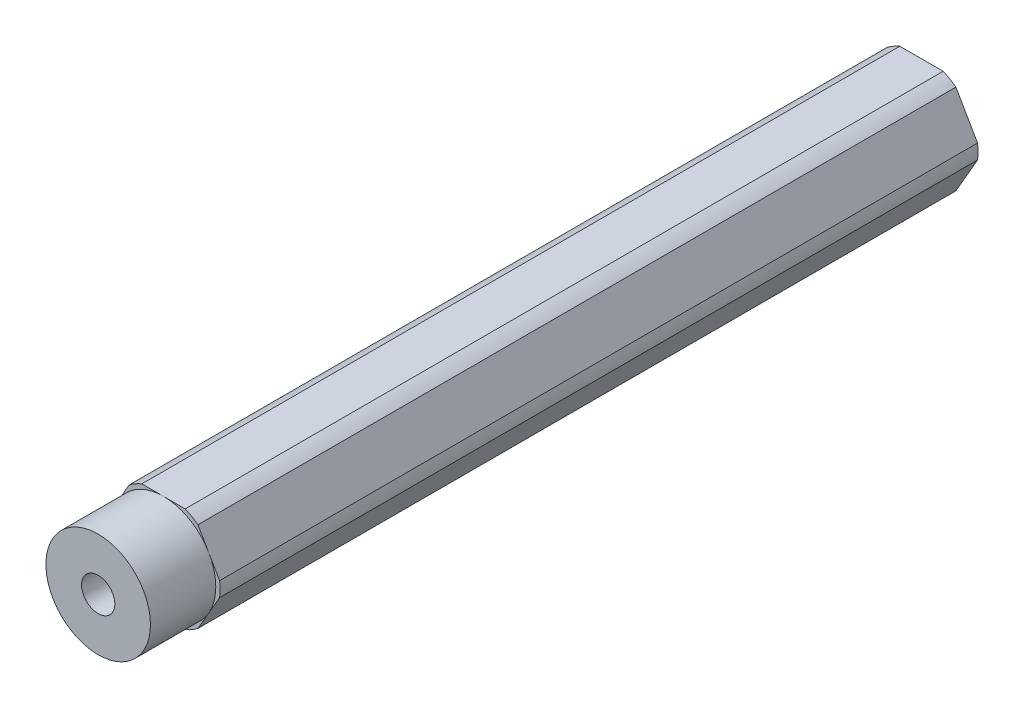
ISO-10303-21;
HEADER;
FILE_DESCRIPTION(('STEP AP214'),'2;1');
FILE_NAME('part.step','',(''),(''),'','','');
FILE_SCHEMA(('AUTOMOTIVE_DESIGN { 1 0 10303 214 1 1 1 1 }'));
ENDSEC;
DATA;
#1=APPLICATION_CONTEXT('core data for automotive mechanical design processes');
#2=APPLICATION_PROTOCOL_DEFINITION('international standard','automotive_design',2000,#1);
#3=PRODUCT_CONTEXT('',#1,'mechanical');
#4=PRODUCT('Part','Part','',(#3));
#5=PRODUCT_RELATED_PRODUCT_CATEGORY('part','',(#4));
#6=PRODUCT_DEFINITION_FORMATION('','',#4);
#7=PRODUCT_DEFINITION_CONTEXT('part definition',#1,'design');
#8=PRODUCT_DEFINITION('design','',#6,#7);
#9=PRODUCT_DEFINITION_SHAPE('','',#8);
#10=(LENGTH_UNIT() NAMED_UNIT(*) SI_UNIT(.MILLI.,.METRE.));
#11=(NAMED_UNIT(*) PLANE_ANGLE_UNIT() SI_UNIT($,.RADIAN.));
#12=(NAMED_UNIT(*) SI_UNIT($,.STERADIAN.) SOLID_ANGLE_UNIT());
#13=UNCERTAINTY_MEASURE_WITH_UNIT(LENGTH_MEASURE(1.E-05),#10,'distance_accuracy_value','');
#14=(GEOMETRIC_REPRESENTATION_CONTEXT(3) GLOBAL_UNCERTAINTY_ASSIGNED_CONTEXT((#13)) GLOBAL_UNIT_ASSIGNED_CONTEXT((#10,
#11,#12)) REPRESENTATION_CONTEXT('',''));
#15=CARTESIAN_POINT('',(0.,0.,0.));
#16=DIRECTION('',(0.,0.,1.));
#17=DIRECTION('',(1.,0.,0.));
#18=AXIS2_PLACEMENT_3D('',#15,#16,#17);
#19=CARTESIAN_POINT('',(5.49926131403118,3.175,50.00625));
#20=DIRECTION('',(-0.866025403784439,-0.5,0.));
#21=DIRECTION('',(0.5,-0.866025403784439,0.));
#22=AXIS2_PLACEMENT_3D('',#19,#20,#21);
#23=PLANE('',#22);
#24=DIRECTION('',(-0.5,0.866025403784439,0.));
#25=VECTOR('',#24,1.);
#26=CARTESIAN_POINT('',(5.49926131403118,3.175,42.06875));
#27=LINE('',#26,#25);
#28=CARTESIAN_POINT('',(6.81675178197583,0.89303957103218,42.06875));
#29=VERTEX_POINT('',#28);
#30=CARTESIAN_POINT('',(5.49926131403118,3.175,42.06875));
#31=VERTEX_POINT('',#30);
#32=EDGE_CURVE('E149',#29,#31,#27,.T.);
#33=ORIENTED_EDGE('',*,*,#32,.F.);
#34=DIRECTION('',(0.,0.,-1.));
#35=VECTOR('',#34,1.);
#36=CARTESIAN_POINT('',(6.81675178197583,0.89303957103218,50.00625));
#37=LINE('',#36,#35);
#38=CARTESIAN_POINT('',(6.81675178197583,0.89303957103218,-50.00625));
#39=VERTEX_POINT('',#38);
#40=EDGE_CURVE('E65',#29,#39,#37,.T.);
#41=ORIENTED_EDGE('',*,*,#40,.T.);
#42=DIRECTION('',(-0.5,0.866025403784439,0.));
#43=VECTOR('',#42,1.);
#44=CARTESIAN_POINT('',(5.49926131403118,3.175,-50.00625));
#45=LINE('',#44,#43);
#46=CARTESIAN_POINT('',(4.18177084608654,5.45696042896782,-50.00625));
#47=VERTEX_POINT('',#46);
#48=EDGE_CURVE('E188',#39,#47,#45,.T.);
#49=ORIENTED_EDGE('',*,*,#48,.T.);
#50=DIRECTION('',(0.,0.,-1.));
#51=VECTOR('',#50,1.);
#52=CARTESIAN_POINT('',(4.18177084608654,5.45696042896782,50.00625));
#53=LINE('',#52,#51);
#54=CARTESIAN_POINT('',(4.18177084608654,5.45696042896782,42.06875));
#55=VERTEX_POINT('',#54);
#56=EDGE_CURVE('E177',#55,#47,#53,.T.);
#57=ORIENTED_EDGE('',*,*,#56,.F.);
#58=EDGE_CURVE('E156',#31,#55,#27,.T.);
#59=ORIENTED_EDGE('',*,*,#58,.F.);
#60=EDGE_LOOP('',(#33,#41,#49,#57,#59));
#61=FACE_BOUND('',#60,.T.);
#62=ADVANCED_FACE('F43',(#61),#23,.F.);
#63=CARTESIAN_POINT('',(0.,0.,50.00625));
#64=DIRECTION('',(0.,0.,-1.));
#65=DIRECTION('',(-1.,0.,0.));
#66=AXIS2_PLACEMENT_3D('',#63,#64,#65);
#67=CYLINDRICAL_SURFACE('',#66,6.874999966);
#68=CARTESIAN_POINT('',(0.,0.,42.06875));
#69=DIRECTION('',(0.,0.,1.));
#70=DIRECTION('',(1.,0.,0.));
#71=AXIS2_PLACEMENT_3D('',#68,#69,#70);
#72=CIRCLE('',#71,6.874999966);
#73=CARTESIAN_POINT('',(2.63498093588928,6.35,42.06875));
#74=VERTEX_POINT('',#73);
#75=EDGE_CURVE('E178',#55,#74,#72,.T.);
#76=ORIENTED_EDGE('',*,*,#75,.F.);
#77=ORIENTED_EDGE('',*,*,#56,.T.);
#78=CARTESIAN_POINT('',(0.,0.,-50.00625));
#79=DIRECTION('',(0.,0.,1.));
#80=DIRECTION('',(1.,0.,0.));
#81=AXIS2_PLACEMENT_3D('',#78,#79,#80);
#82=CIRCLE('',#81,6.874999966);
#83=CARTESIAN_POINT('',(2.63498093588928,6.35,-50.00625));
#84=VERTEX_POINT('',#83);
#85=EDGE_CURVE('E190',#47,#84,#82,.T.);
#86=ORIENTED_EDGE('',*,*,#85,.T.);
#87=DIRECTION('',(0.,0.,-1.));
#88=VECTOR('',#87,1.);
#89=CARTESIAN_POINT('',(2.63498093588928,6.35,50.00625));
#90=LINE('',#89,#88);
#91=EDGE_CURVE('E231',#74,#84,#90,.T.);
#92=ORIENTED_EDGE('',*,*,#91,.F.);
#93=EDGE_LOOP('',(#76,#77,#86,#92));
#94=FACE_BOUND('',#93,.T.);
#95=ADVANCED_FACE('F248',(#94),#67,.T.);
#96=CARTESIAN_POINT('',(0.,6.35,50.00625));
#97=DIRECTION('',(0.,-1.,0.));
#98=DIRECTION('',(1.,0.,0.));
#99=AXIS2_PLACEMENT_3D('',#96,#97,#98);
#100=PLANE('',#99);
#101=DIRECTION('',(-1.,0.,0.));
#102=VECTOR('',#101,1.);
#103=CARTESIAN_POINT('',(0.,6.35,42.06875));
#104=LINE('',#103,#102);
#105=CARTESIAN_POINT('',(0.,6.35,42.06875));
#106=VERTEX_POINT('',#105);
#107=EDGE_CURVE('E173',#74,#106,#104,.T.);
#108=ORIENTED_EDGE('',*,*,#107,.F.);
#109=ORIENTED_EDGE('',*,*,#91,.T.);
#110=DIRECTION('',(-1.,0.,0.));
#111=VECTOR('',#110,1.);
#112=CARTESIAN_POINT('',(0.,6.35,-50.00625));
#113=LINE('',#112,#111);
#114=CARTESIAN_POINT('',(-2.63498093588929,6.35,-50.00625));
#115=VERTEX_POINT('',#114);
#116=EDGE_CURVE('E193',#84,#115,#113,.T.);
#117=ORIENTED_EDGE('',*,*,#116,.T.);
#118=DIRECTION('',(0.,0.,-1.));
#119=VECTOR('',#118,1.);
#120=CARTESIAN_POINT('',(-2.63498093588929,6.35,50.00625));
#121=LINE('',#120,#119);
#122=CARTESIAN_POINT('',(-2.63498093588929,6.35,42.06875));
#123=VERTEX_POINT('',#122);
#124=EDGE_CURVE('E229',#123,#115,#121,.T.);
#125=ORIENTED_EDGE('',*,*,#124,.F.);
#126=EDGE_CURVE('E300',#106,#123,#104,.T.);
#127=ORIENTED_EDGE('',*,*,#126,.F.);
#128=EDGE_LOOP('',(#108,#109,#117,#125,#127));
#129=FACE_BOUND('',#128,.T.);
#130=ADVANCED_FACE('F252',(#129),#100,.F.);
#131=CARTESIAN_POINT('',(0.,0.,42.06875));
#132=DIRECTION('',(0.,0.,1.));
#133=DIRECTION('',(1.,0.,0.));
#134=AXIS2_PLACEMENT_3D('',#131,#132,#133);
#135=CIRCLE('',#134,6.874999966);
#136=CARTESIAN_POINT('',(-4.18177084608653,5.45696042896783,42.06875));
#137=VERTEX_POINT('',#136);
#138=EDGE_CURVE('E302',#123,#137,#135,.T.);
#139=ORIENTED_EDGE('',*,*,#138,.F.);
#140=ORIENTED_EDGE('',*,*,#124,.T.);
#141=CARTESIAN_POINT('',(-4.18177084608653,5.45696042896783,-50.00625));
#142=VERTEX_POINT('',#141);
#143=EDGE_CURVE('E194',#115,#142,#82,.T.);
#144=ORIENTED_EDGE('',*,*,#143,.T.);
#145=DIRECTION('',(0.,0.,-1.));
#146=VECTOR('',#145,1.);
#147=CARTESIAN_POINT('',(-4.18177084608653,5.45696042896783,50.00625));
#148=LINE('',#147,#146);
#149=EDGE_CURVE('E227',#137,#142,#148,.T.);
#150=ORIENTED_EDGE('',*,*,#149,.F.);
#151=EDGE_LOOP('',(#139,#140,#144,#150));
#152=FACE_BOUND('',#151,.T.);
#153=ADVANCED_FACE('F255',(#152),#67,.T.);
#154=CARTESIAN_POINT('',(-5.49926131403118,3.17499999999999,50.00625));
#155=DIRECTION('',(0.866025403784439,-0.499999999999999,0.));
#156=DIRECTION('',(0.499999999999999,0.866025403784439,0.));
#157=AXIS2_PLACEMENT_3D('',#154,#155,#156);
#158=PLANE('',#157);
#159=DIRECTION('',(-0.499999999999999,-0.866025403784439,0.));
#160=VECTOR('',#159,1.);
#161=CARTESIAN_POINT('',(-5.49926131403118,3.17499999999999,42.06875));
#162=LINE('',#161,#160);
#163=CARTESIAN_POINT('',(-5.49926131403119,3.17499999999999,42.06875));
#164=VERTEX_POINT('',#163);
#165=EDGE_CURVE('E308',#137,#164,#162,.T.);
#166=ORIENTED_EDGE('',*,*,#165,.F.);
#167=ORIENTED_EDGE('',*,*,#149,.T.);
#168=DIRECTION('',(-0.499999999999999,-0.866025403784439,0.));
#169=VECTOR('',#168,1.);
#170=CARTESIAN_POINT('',(-5.49926131403118,3.17499999999999,-50.00625));
#171=LINE('',#170,#169);
#172=CARTESIAN_POINT('',(-6.81675178197584,0.893039571032146,-50.00625));
#173=VERTEX_POINT('',#172);
#174=EDGE_CURVE('E197',#142,#173,#171,.T.);
#175=ORIENTED_EDGE('',*,*,#174,.T.);
#176=DIRECTION('',(0.,0.,-1.));
#177=VECTOR('',#176,1.);
#178=CARTESIAN_POINT('',(-6.81675178197584,0.893039571032146,50.00625));
#179=LINE('',#178,#177);
#180=CARTESIAN_POINT('',(-6.81675178197584,0.893039571032145,42.06875));
#181=VERTEX_POINT('',#180);
#182=EDGE_CURVE('E225',#181,#173,#179,.T.);
#183=ORIENTED_EDGE('',*,*,#182,.F.);
#184=EDGE_CURVE('E336',#164,#181,#162,.T.);
#185=ORIENTED_EDGE('',*,*,#184,.F.);
#186=EDGE_LOOP('',(#166,#167,#175,#183,#185));
#187=FACE_BOUND('',#186,.T.);
#188=ADVANCED_FACE('F261',(#187),#158,.F.);
#189=CARTESIAN_POINT('',(0.,0.,42.06875));
#190=DIRECTION('',(0.,0.,1.));
#191=DIRECTION('',(1.,0.,0.));
#192=AXIS2_PLACEMENT_3D('',#189,#190,#191);
#193=CIRCLE('',#192,6.874999966);
#194=CARTESIAN_POINT('',(-6.81675178197583,-0.893039571032152,42.06875));
#195=VERTEX_POINT('',#194);
#196=EDGE_CURVE('E338',#181,#195,#193,.T.);
#197=ORIENTED_EDGE('',*,*,#196,.F.);
#198=ORIENTED_EDGE('',*,*,#182,.T.);
#199=CARTESIAN_POINT('',(-6.81675178197583,-0.893039571032152,-50.00625));
#200=VERTEX_POINT('',#199);
#201=EDGE_CURVE('E200',#173,#200,#82,.T.);
#202=ORIENTED_EDGE('',*,*,#201,.T.);
#203=DIRECTION('',(0.,0.,-1.));
#204=VECTOR('',#203,1.);
#205=CARTESIAN_POINT('',(-6.81675178197583,-0.893039571032152,50.00625));
#206=LINE('',#205,#204);
#207=EDGE_CURVE('E223',#195,#200,#206,.T.);
#208=ORIENTED_EDGE('',*,*,#207,.F.);
#209=EDGE_LOOP('',(#197,#198,#202,#208));
#210=FACE_BOUND('',#209,.T.);
#211=ADVANCED_FACE('F264',(#210),#67,.T.);
#212=CARTESIAN_POINT('',(-5.49926131403117,-3.175,50.00625));
#213=DIRECTION('',(0.866025403784438,0.500000000000001,0.));
#214=DIRECTION('',(-0.500000000000001,0.866025403784438,0.));
#215=AXIS2_PLACEMENT_3D('',#212,#213,#214);
#216=PLANE('',#215);
#217=DIRECTION('',(0.500000000000001,-0.866025403784438,0.));
#218=VECTOR('',#217,1.);
#219=CARTESIAN_POINT('',(-5.49926131403117,-3.175,42.06875));
#220=LINE('',#219,#218);
#221=CARTESIAN_POINT('',(-5.49926131403118,-3.17500000000001,42.06875));
#222=VERTEX_POINT('',#221);
#223=EDGE_CURVE('E340',#195,#222,#220,.T.);
#224=ORIENTED_EDGE('',*,*,#223,.F.);
#225=ORIENTED_EDGE('',*,*,#207,.T.);
#226=DIRECTION('',(0.500000000000001,-0.866025403784438,0.));
#227=VECTOR('',#226,1.);
#228=CARTESIAN_POINT('',(-5.49926131403117,-3.175,-50.00625));
#229=LINE('',#228,#227);
#230=CARTESIAN_POINT('',(-4.18177084608651,-5.45696042896785,-50.00625));
#231=VERTEX_POINT('',#230);
#232=EDGE_CURVE('E201',#200,#231,#229,.T.);
#233=ORIENTED_EDGE('',*,*,#232,.T.);
#234=DIRECTION('',(0.,0.,-1.));
#235=VECTOR('',#234,1.);
#236=CARTESIAN_POINT('',(-4.18177084608651,-5.45696042896785,50.00625));
#237=LINE('',#236,#235);
#238=CARTESIAN_POINT('',(-4.18177084608651,-5.45696042896785,42.06875));
#239=VERTEX_POINT('',#238);
#240=EDGE_CURVE('E221',#239,#231,#237,.T.);
#241=ORIENTED_EDGE('',*,*,#240,.F.);
#242=EDGE_CURVE('E341',#222,#239,#220,.T.);
#243=ORIENTED_EDGE('',*,*,#242,.F.);
#244=EDGE_LOOP('',(#224,#225,#233,#241,#243));
#245=FACE_BOUND('',#244,.T.);
#246=ADVANCED_FACE('F266',(#245),#216,.F.);
#247=CARTESIAN_POINT('',(0.,0.,42.06875));
#248=DIRECTION('',(0.,0.,1.));
#249=DIRECTION('',(1.,0.,0.));
#250=AXIS2_PLACEMENT_3D('',#247,#248,#249);
#251=CIRCLE('',#250,6.874999966);
#252=CARTESIAN_POINT('',(-2.63498093588926,-6.35000000000001,42.06875));
#253=VERTEX_POINT('',#252);
#254=EDGE_CURVE('E343',#239,#253,#251,.T.);
#255=ORIENTED_EDGE('',*,*,#254,.F.);
#256=ORIENTED_EDGE('',*,*,#240,.T.);
#257=CARTESIAN_POINT('',(-2.63498093588926,-6.35000000000001,-50.00625));
#258=VERTEX_POINT('',#257);
#259=EDGE_CURVE('E204',#231,#258,#82,.T.);
#260=ORIENTED_EDGE('',*,*,#259,.T.);
#261=DIRECTION('',(0.,0.,-1.));
#262=VECTOR('',#261,1.);
#263=CARTESIAN_POINT('',(-2.63498093588926,-6.35000000000001,50.00625));
#264=LINE('',#263,#262);
#265=EDGE_CURVE('E219',#253,#258,#264,.T.);
#266=ORIENTED_EDGE('',*,*,#265,.F.);
#267=EDGE_LOOP('',(#255,#256,#260,#266));
#268=FACE_BOUND('',#267,.T.);
#269=ADVANCED_FACE('F269',(#268),#67,.T.);
#270=CARTESIAN_POINT('',(0.,-6.35000000000001,50.00625));
#271=DIRECTION('',(0.,1.,0.));
#272=DIRECTION('',(-1.,0.,0.));
#273=AXIS2_PLACEMENT_3D('',#270,#271,#272);
#274=PLANE('',#273);
#275=DIRECTION('',(1.,0.,0.));
#276=VECTOR('',#275,1.);
#277=CARTESIAN_POINT('',(0.,-6.35000000000001,42.06875));
#278=LINE('',#277,#276);
#279=CARTESIAN_POINT('',(0.,-6.35,42.06875));
#280=VERTEX_POINT('',#279);
#281=EDGE_CURVE('E345',#253,#280,#278,.T.);
#282=ORIENTED_EDGE('',*,*,#281,.F.);
#283=ORIENTED_EDGE('',*,*,#265,.T.);
#284=DIRECTION('',(1.,0.,0.));
#285=VECTOR('',#284,1.);
#286=CARTESIAN_POINT('',(0.,-6.35000000000001,-50.00625));
#287=LINE('',#286,#285);
#288=CARTESIAN_POINT('',(2.63498093588927,-6.35000000000001,-50.00625));
#289=VERTEX_POINT('',#288);
#290=EDGE_CURVE('E205',#258,#289,#287,.T.);
#291=ORIENTED_EDGE('',*,*,#290,.T.);
#292=DIRECTION('',(0.,0.,-1.));
#293=VECTOR('',#292,1.);
#294=CARTESIAN_POINT('',(2.63498093588927,-6.35000000000001,50.00625));
#295=LINE('',#294,#293);
#296=CARTESIAN_POINT('',(2.63498093588927,-6.35000000000001,42.06875));
#297=VERTEX_POINT('',#296);
#298=EDGE_CURVE('E217',#297,#289,#295,.T.);
#299=ORIENTED_EDGE('',*,*,#298,.F.);
#300=EDGE_CURVE('E346',#280,#297,#278,.T.);
#301=ORIENTED_EDGE('',*,*,#300,.F.);
#302=EDGE_LOOP('',(#282,#283,#291,#299,#301));
#303=FACE_BOUND('',#302,.T.);
#304=ADVANCED_FACE('F271',(#303),#274,.F.);
#305=CARTESIAN_POINT('',(0.,0.,42.06875));
#306=DIRECTION('',(0.,0.,1.));
#307=DIRECTION('',(1.,0.,0.));
#308=AXIS2_PLACEMENT_3D('',#305,#306,#307);
#309=CIRCLE('',#308,6.874999966);
#310=CARTESIAN_POINT('',(4.18177084608654,-5.45696042896782,42.06875));
#311=VERTEX_POINT('',#310);
#312=EDGE_CURVE('E348',#297,#311,#309,.T.);
#313=ORIENTED_EDGE('',*,*,#312,.F.);
#314=ORIENTED_EDGE('',*,*,#298,.T.);
#315=CARTESIAN_POINT('',(4.18177084608654,-5.45696042896782,-50.00625));
#316=VERTEX_POINT('',#315);
#317=EDGE_CURVE('E208',#289,#316,#82,.T.);
#318=ORIENTED_EDGE('',*,*,#317,.T.);
#319=DIRECTION('',(0.,0.,-1.));
#320=VECTOR('',#319,1.);
#321=CARTESIAN_POINT('',(4.18177084608654,-5.45696042896782,50.00625));
#322=LINE('',#321,#320);
#323=EDGE_CURVE('E215',#311,#316,#322,.T.);
#324=ORIENTED_EDGE('',*,*,#323,.F.);
#325=EDGE_LOOP('',(#313,#314,#318,#324));
#326=FACE_BOUND('',#325,.T.);
#327=ADVANCED_FACE('F274',(#326),#67,.T.);
#328=CARTESIAN_POINT('',(5.49926131403119,-3.17499999999999,50.00625));
#329=DIRECTION('',(-0.866025403784439,0.499999999999999,0.));
#330=DIRECTION('',(-0.499999999999999,-0.866025403784439,0.));
#331=AXIS2_PLACEMENT_3D('',#328,#329,#330);
#332=PLANE('',#331);
#333=DIRECTION('',(0.499999999999999,0.866025403784439,0.));
#334=VECTOR('',#333,1.);
#335=CARTESIAN_POINT('',(5.49926131403119,-3.17499999999999,42.06875));
#336=LINE('',#335,#334);
#337=CARTESIAN_POINT('',(5.49926131403119,-3.17499999999999,42.06875));
#338=VERTEX_POINT('',#337);
#339=EDGE_CURVE('E350',#311,#338,#336,.T.);
#340=ORIENTED_EDGE('',*,*,#339,.F.);
#341=ORIENTED_EDGE('',*,*,#323,.T.);
#342=DIRECTION('',(0.499999999999999,0.866025403784439,0.));
#343=VECTOR('',#342,1.);
#344=CARTESIAN_POINT('',(5.49926131403119,-3.17499999999999,-50.00625));
#345=LINE('',#344,#343);
#346=CARTESIAN_POINT('',(6.81675178197583,-0.893039571032165,-50.00625));
#347=VERTEX_POINT('',#346);
#348=EDGE_CURVE('E209',#316,#347,#345,.T.);
#349=ORIENTED_EDGE('',*,*,#348,.T.);
#350=DIRECTION('',(0.,0.,-1.));
#351=VECTOR('',#350,1.);
#352=CARTESIAN_POINT('',(6.81675178197583,-0.893039571032165,50.00625));
#353=LINE('',#352,#351);
#354=CARTESIAN_POINT('',(6.81675178197583,-0.893039571032165,42.06875));
#355=VERTEX_POINT('',#354);
#356=EDGE_CURVE('E213',#355,#347,#353,.T.);
#357=ORIENTED_EDGE('',*,*,#356,.F.);
#358=EDGE_CURVE('E57',#338,#355,#336,.T.);
#359=ORIENTED_EDGE('',*,*,#358,.F.);
#360=EDGE_LOOP('',(#340,#341,#349,#357,#359));
#361=FACE_BOUND('',#360,.T.);
#362=ADVANCED_FACE('F276',(#361),#332,.F.);
#363=CARTESIAN_POINT('',(0.,0.,42.06875));
#364=DIRECTION('',(0.,0.,1.));
#365=DIRECTION('',(1.,0.,0.));
#366=AXIS2_PLACEMENT_3D('',#363,#364,#365);
#367=CIRCLE('',#366,6.874999966);
#368=EDGE_CURVE('E12',#355,#29,#367,.T.);
#369=ORIENTED_EDGE('',*,*,#368,.F.);
#370=ORIENTED_EDGE('',*,*,#356,.T.);
#371=EDGE_CURVE('E185',#347,#39,#82,.T.);
#372=ORIENTED_EDGE('',*,*,#371,.T.);
#373=ORIENTED_EDGE('',*,*,#40,.F.);
#374=EDGE_LOOP('',(#369,#370,#372,#373));
#375=FACE_BOUND('',#374,.T.);
#376=ADVANCED_FACE('F256',(#375),#67,.T.);
#377=CARTESIAN_POINT('',(0.,0.,50.00625));
#378=DIRECTION('',(0.,0.,1.));
#379=DIRECTION('',(1.,0.,0.));
#380=AXIS2_PLACEMENT_3D('',#377,#378,#379);
#381=PLANE('',#380);
#382=CARTESIAN_POINT('',(0.,0.,50.00625));
#383=DIRECTION('',(0.,0.,1.));
#384=DIRECTION('',(1.,0.,0.));
#385=AXIS2_PLACEMENT_3D('',#382,#383,#384);
#386=CIRCLE('',#385,2.0193);
#387=CARTESIAN_POINT('',(-2.0193,0.,50.00625));
#388=VERTEX_POINT('',#387);
#389=EDGE_CURVE('E182',#388,#388,#386,.T.);
#390=ORIENTED_EDGE('',*,*,#389,.F.);
#391=EDGE_LOOP('',(#390));
#392=FACE_BOUND('',#391,.T.);
#393=CARTESIAN_POINT('',(0.,0.,50.00625));
#394=DIRECTION('',(0.,0.,1.));
#395=DIRECTION('',(1.,0.,0.));
#396=AXIS2_PLACEMENT_3D('',#393,#394,#395);
#397=CIRCLE('',#396,6.35);
#398=CARTESIAN_POINT('',(6.35,0.,50.00625));
#399=VERTEX_POINT('',#398);
#400=EDGE_CURVE('E51',#399,#399,#397,.T.);
#401=ORIENTED_EDGE('',*,*,#400,.T.);
#402=EDGE_LOOP('',(#401));
#403=FACE_BOUND('',#402,.T.);
#404=ADVANCED_FACE('F236',(#392,#403),#381,.T.);
#405=CARTESIAN_POINT('',(0.,0.,50.00625));
#406=DIRECTION('',(0.,0.,-1.));
#407=DIRECTION('',(-1.,0.,0.));
#408=AXIS2_PLACEMENT_3D('',#405,#406,#407);
#409=CYLINDRICAL_SURFACE('',#408,2.0193);
#410=CARTESIAN_POINT('',(0.,0.,-50.00625));
#411=DIRECTION('',(0.,0.,1.));
#412=DIRECTION('',(1.,0.,0.));
#413=AXIS2_PLACEMENT_3D('',#410,#411,#412);
#414=CIRCLE('',#413,2.0193);
#415=CARTESIAN_POINT('',(-2.0193,0.,-50.00625));
#416=VERTEX_POINT('',#415);
#417=EDGE_CURVE('E155',#416,#416,#414,.T.);
#418=CARTESIAN_POINT('',(-2.0193,0.,50.00625));
#419=CARTESIAN_POINT('',(-2.0193,0.,48.964453125));
#420=CARTESIAN_POINT('',(-2.0193,0.,47.92265625));
#421=CARTESIAN_POINT('',(-2.0193,0.,45.8390625));
#422=CARTESIAN_POINT('',(-2.0193,0.,44.797265625));
#423=CARTESIAN_POINT('',(-2.0193,0.,42.713671875));
#424=CARTESIAN_POINT('',(-2.0193,0.,41.671875));
#425=CARTESIAN_POINT('',(-2.0193,0.,39.58828125));
#426=CARTESIAN_POINT('',(-2.0193,0.,38.546484375));
#427=CARTESIAN_POINT('',(-2.0193,0.,36.462890625));
#428=CARTESIAN_POINT('',(-2.0193,0.,35.42109375));
#429=CARTESIAN_POINT('',(-2.0193,0.,33.3375));
#430=CARTESIAN_POINT('',(-2.0193,0.,32.295703125));
#431=CARTESIAN_POINT('',(-2.0193,0.,30.212109375));
#432=CARTESIAN_POINT('',(-2.0193,0.,29.1703125));
#433=CARTESIAN_POINT('',(-2.0193,0.,27.08671875));
#434=CARTESIAN_POINT('',(-2.0193,0.,26.044921875));
#435=CARTESIAN_POINT('',(-2.0193,0.,23.961328125));
#436=CARTESIAN_POINT('',(-2.0193,0.,22.91953125));
#437=CARTESIAN_POINT('',(-2.0193,0.,20.8359375));
#438=CARTESIAN_POINT('',(-2.0193,0.,19.794140625));
#439=CARTESIAN_POINT('',(-2.0193,0.,17.710546875));
#440=CARTESIAN_POINT('',(-2.0193,0.,16.66875));
#441=CARTESIAN_POINT('',(-2.0193,0.,14.58515625));
#442=CARTESIAN_POINT('',(-2.0193,0.,13.543359375));
#443=CARTESIAN_POINT('',(-2.0193,0.,11.459765625));
#444=CARTESIAN_POINT('',(-2.0193,0.,10.41796875));
#445=CARTESIAN_POINT('',(-2.0193,0.,8.334375));
#446=CARTESIAN_POINT('',(-2.0193,0.,7.292578125));
#447=CARTESIAN_POINT('',(-2.0193,0.,5.208984375));
#448=CARTESIAN_POINT('',(-2.0193,0.,4.1671875));
#449=CARTESIAN_POINT('',(-2.0193,0.,2.08359375));
#450=CARTESIAN_POINT('',(-2.0193,0.,1.041796875));
#451=CARTESIAN_POINT('',(-2.0193,0.,-1.041796875));
#452=CARTESIAN_POINT('',(-2.0193,0.,-2.08359375));
#453=CARTESIAN_POINT('',(-2.0193,0.,-4.1671875));
#454=CARTESIAN_POINT('',(-2.0193,0.,-5.208984375));
#455=CARTESIAN_POINT('',(-2.0193,0.,-7.292578125));
#456=CARTESIAN_POINT('',(-2.0193,0.,-8.334375));
#457=CARTESIAN_POINT('',(-2.0193,0.,-10.41796875));
#458=CARTESIAN_POINT('',(-2.0193,0.,-11.459765625));
#459=CARTESIAN_POINT('',(-2.0193,0.,-13.543359375));
#460=CARTESIAN_POINT('',(-2.0193,0.,-14.58515625));
#461=CARTESIAN_POINT('',(-2.0193,0.,-16.66875));
#462=CARTESIAN_POINT('',(-2.0193,0.,-17.710546875));
#463=CARTESIAN_POINT('',(-2.0193,0.,-19.794140625));
#464=CARTESIAN_POINT('',(-2.0193,0.,-20.8359375));
#465=CARTESIAN_POINT('',(-2.0193,0.,-22.91953125));
#466=CARTESIAN_POINT('',(-2.0193,0.,-23.961328125));
#467=CARTESIAN_POINT('',(-2.0193,0.,-26.044921875));
#468=CARTESIAN_POINT('',(-2.0193,0.,-27.08671875));
#469=CARTESIAN_POINT('',(-2.0193,0.,-29.1703125));
#470=CARTESIAN_POINT('',(-2.0193,0.,-30.212109375));
#471=CARTESIAN_POINT('',(-2.0193,0.,-32.295703125));
#472=CARTESIAN_POINT('',(-2.0193,0.,-33.3375));
#473=CARTESIAN_POINT('',(-2.0193,0.,-35.42109375));
#474=CARTESIAN_POINT('',(-2.0193,0.,-36.462890625));
#475=CARTESIAN_POINT('',(-2.0193,0.,-38.546484375));
#476=CARTESIAN_POINT('',(-2.0193,0.,-39.58828125));
#477=CARTESIAN_POINT('',(-2.0193,0.,-41.671875));
#478=CARTESIAN_POINT('',(-2.0193,0.,-42.713671875));
#479=CARTESIAN_POINT('',(-2.0193,0.,-44.797265625));
#480=CARTESIAN_POINT('',(-2.0193,0.,-45.8390625));
#481=CARTESIAN_POINT('',(-2.0193,0.,-47.92265625));
#482=CARTESIAN_POINT('',(-2.0193,0.,-48.964453125));
#483=CARTESIAN_POINT('',(-2.0193,0.,-50.00625));
#484=B_SPLINE_CURVE_WITH_KNOTS('',3,(#418,#419,#420,#421,#422,#423,#424,#425,#426,#427,#428,
#429,#430,#431,#432,#433,#434,#435,#436,#437,#438,#439,#440,#441,#442,#443,#444,#445,#446,#447,
#448,#449,#450,#451,#452,#453,#454,#455,#456,#457,#458,#459,#460,#461,#462,#463,#464,#465,#466,
#467,#468,#469,#470,#471,#472,#473,#474,#475,#476,#477,#478,#479,#480,#481,#482,#483),
.UNSPECIFIED.,.F.,.F.,(4,2,2,2,2,2,2,2,2,2,2,2,2,2,2,2,2,2,2,2,2,2,2,2,2,2,2,2,2,2,2,2,4),(0.,
3.125390625,6.25078125,9.376171875,12.5015625,15.626953125,18.75234375,21.877734375,25.003125,
28.128515625,31.25390625,34.379296875,37.5046875,40.630078125,43.75546875,46.880859375,50.00625,
53.131640625,56.25703125,59.382421875,62.5078125,65.633203125,68.75859375,71.883984375,
75.009375,78.134765625,81.26015625,84.385546875,87.5109375,90.636328125,93.76171875,
96.887109375,100.0125),.UNSPECIFIED.);
#485=EDGE_CURVE('BSEAM45',#388,#416,#484,.T.);
#486=ORIENTED_EDGE('',*,*,#389,.T.);
#487=ORIENTED_EDGE('',*,*,#417,.F.);
#488=ORIENTED_EDGE('',*,*,#485,.T.);
#489=ORIENTED_EDGE('',*,*,#485,.F.);
#490=EDGE_LOOP('',(#486,#488,#487,#489));
#491=FACE_BOUND('',#490,.T.);
#492=ADVANCED_FACE('F45',(#491),#409,.F.);
#493=CARTESIAN_POINT('',(0.,0.,-50.00625));
#494=DIRECTION('',(0.,0.,1.));
#495=DIRECTION('',(1.,0.,0.));
#496=AXIS2_PLACEMENT_3D('',#493,#494,#495);
#497=PLANE('',#496);
#498=ORIENTED_EDGE('',*,*,#417,.T.);
#499=EDGE_LOOP('',(#498));
#500=FACE_BOUND('',#499,.T.);
#501=ORIENTED_EDGE('',*,*,#48,.F.);
#502=ORIENTED_EDGE('',*,*,#371,.F.);
#503=ORIENTED_EDGE('',*,*,#348,.F.);
#504=ORIENTED_EDGE('',*,*,#317,.F.);
#505=ORIENTED_EDGE('',*,*,#290,.F.);
#506=ORIENTED_EDGE('',*,*,#259,.F.);
#507=ORIENTED_EDGE('',*,*,#232,.F.);
#508=ORIENTED_EDGE('',*,*,#201,.F.);
#509=ORIENTED_EDGE('',*,*,#174,.F.);
#510=ORIENTED_EDGE('',*,*,#143,.F.);
#511=ORIENTED_EDGE('',*,*,#116,.F.);
#512=ORIENTED_EDGE('',*,*,#85,.F.);
#513=EDGE_LOOP('',(#501,#502,#503,#504,#505,#506,#507,#508,#509,#510,#511,#512));
#514=FACE_BOUND('',#513,.T.);
#515=ADVANCED_FACE('F280',(#500,#514),#497,.F.);
#516=CARTESIAN_POINT('',(0.,0.,42.06875));
#517=DIRECTION('',(0.,0.,1.));
#518=DIRECTION('',(1.,0.,0.));
#519=AXIS2_PLACEMENT_3D('',#516,#517,#518);
#520=PLANE('',#519);
#521=ORIENTED_EDGE('',*,*,#32,.T.);
#522=CARTESIAN_POINT('',(0.,0.,42.06875));
#523=DIRECTION('',(0.,0.,1.));
#524=DIRECTION('',(1.,0.,0.));
#525=AXIS2_PLACEMENT_3D('',#522,#523,#524);
#526=CIRCLE('',#525,6.35);
#527=EDGE_CURVE('E152',#338,#31,#526,.T.);
#528=ORIENTED_EDGE('',*,*,#527,.F.);
#529=ORIENTED_EDGE('',*,*,#358,.T.);
#530=ORIENTED_EDGE('',*,*,#368,.T.);
#531=EDGE_LOOP('',(#521,#528,#529,#530));
#532=FACE_BOUND('',#531,.T.);
#533=ADVANCED_FACE('F151',(#532),#520,.T.);
#534=ORIENTED_EDGE('',*,*,#58,.T.);
#535=ORIENTED_EDGE('',*,*,#75,.T.);
#536=ORIENTED_EDGE('',*,*,#107,.T.);
#537=EDGE_CURVE('E163',#31,#106,#526,.T.);
#538=ORIENTED_EDGE('',*,*,#537,.F.);
#539=EDGE_LOOP('',(#534,#535,#536,#538));
#540=FACE_BOUND('',#539,.T.);
#541=ADVANCED_FACE('F170',(#540),#520,.T.);
#542=ORIENTED_EDGE('',*,*,#126,.T.);
#543=ORIENTED_EDGE('',*,*,#138,.T.);
#544=ORIENTED_EDGE('',*,*,#165,.T.);
#545=EDGE_CURVE('E175',#106,#164,#526,.T.);
#546=ORIENTED_EDGE('',*,*,#545,.F.);
#547=EDGE_LOOP('',(#542,#543,#544,#546));
#548=FACE_BOUND('',#547,.T.);
#549=ADVANCED_FACE('F290',(#548),#520,.T.);
#550=ORIENTED_EDGE('',*,*,#184,.T.);
#551=ORIENTED_EDGE('',*,*,#196,.T.);
#552=ORIENTED_EDGE('',*,*,#223,.T.);
#553=EDGE_CURVE('E364',#164,#222,#526,.T.);
#554=ORIENTED_EDGE('',*,*,#553,.F.);
#555=EDGE_LOOP('',(#550,#551,#552,#554));
#556=FACE_BOUND('',#555,.T.);
#557=ADVANCED_FACE('F294',(#556),#520,.T.);
#558=ORIENTED_EDGE('',*,*,#242,.T.);
#559=ORIENTED_EDGE('',*,*,#254,.T.);
#560=ORIENTED_EDGE('',*,*,#281,.T.);
#561=EDGE_CURVE('E366',#222,#280,#526,.T.);
#562=ORIENTED_EDGE('',*,*,#561,.F.);
#563=EDGE_LOOP('',(#558,#559,#560,#562));
#564=FACE_BOUND('',#563,.T.);
#565=ADVANCED_FACE('F244',(#564),#520,.T.);
#566=ORIENTED_EDGE('',*,*,#300,.T.);
#567=ORIENTED_EDGE('',*,*,#312,.T.);
#568=ORIENTED_EDGE('',*,*,#339,.T.);
#569=EDGE_CURVE('E167',#280,#338,#526,.T.);
#570=ORIENTED_EDGE('',*,*,#569,.F.);
#571=EDGE_LOOP('',(#566,#567,#568,#570));
#572=FACE_BOUND('',#571,.T.);
#573=ADVANCED_FACE('F239',(#572),#520,.T.);
#574=CARTESIAN_POINT('',(0.,0.,42.06875));
#575=DIRECTION('',(0.,0.,1.));
#576=DIRECTION('',(1.,0.,0.));
#577=AXIS2_PLACEMENT_3D('',#574,#575,#576);
#578=CYLINDRICAL_SURFACE('',#577,6.35);
#579=ORIENTED_EDGE('',*,*,#400,.F.);
#580=EDGE_LOOP('',(#579));
#581=FACE_BOUND('',#580,.T.);
#582=ORIENTED_EDGE('',*,*,#527,.T.);
#583=ORIENTED_EDGE('',*,*,#537,.T.);
#584=ORIENTED_EDGE('',*,*,#545,.T.);
#585=ORIENTED_EDGE('',*,*,#553,.T.);
#586=ORIENTED_EDGE('',*,*,#561,.T.);
#587=ORIENTED_EDGE('',*,*,#569,.T.);
#588=EDGE_LOOP('',(#582,#583,#584,#585,#586,#587));
#589=FACE_BOUND('',#588,.T.);
#590=ADVANCED_FACE('F161',(#581,#589),#578,.T.);
#591=CLOSED_SHELL('',(#62,#95,#130,#153,#188,#211,#246,#269,#304,#327,#362,#376,#404,#492,#515,
#533,#541,#549,#557,#565,#573,#590));
#592=MANIFOLD_SOLID_BREP('B2',#591);
#593=ADVANCED_BREP_SHAPE_REPRESENTATION('',(#18,#592),#14);
#594=SHAPE_DEFINITION_REPRESENTATION(#9,#593);
ENDSEC;
END-ISO-10303-21;
